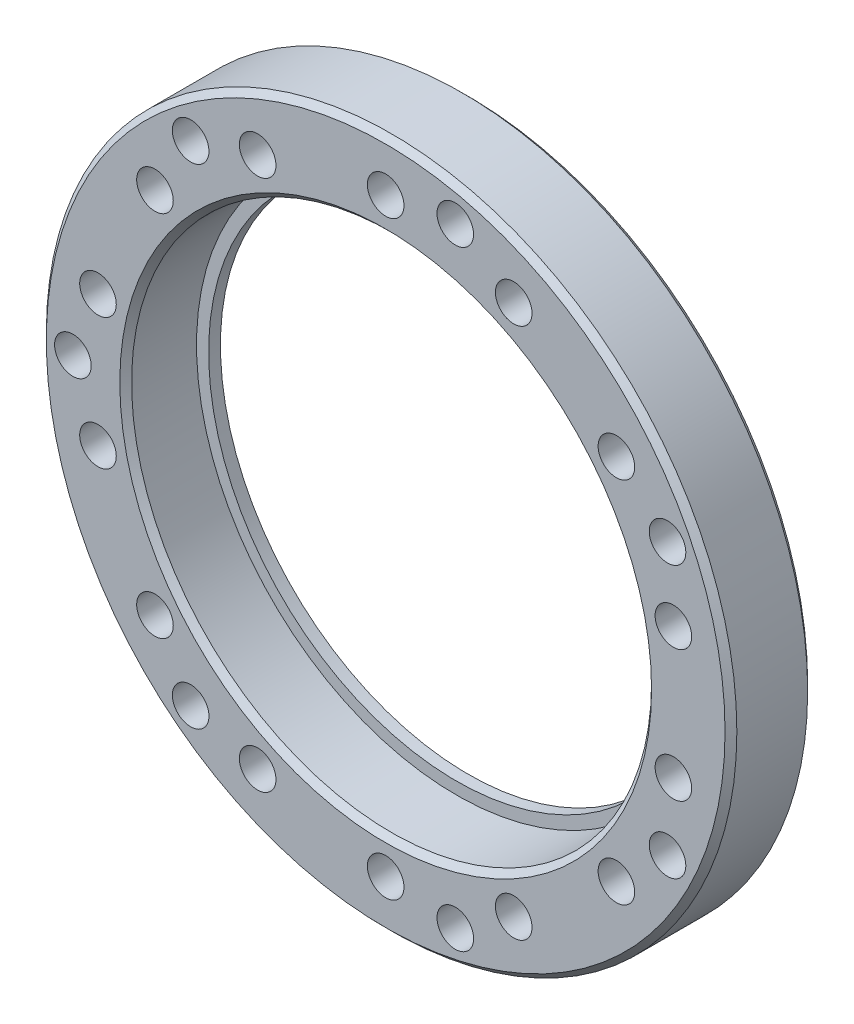
ISO-10303-21;
HEADER;
FILE_DESCRIPTION(('STEP AP214'),'2;1');
FILE_NAME('part.step','',(''),(''),'','','');
FILE_SCHEMA(('AUTOMOTIVE_DESIGN { 1 0 10303 214 1 1 1 1 }'));
ENDSEC;
DATA;
#1=APPLICATION_CONTEXT('core data for automotive mechanical design processes');
#2=APPLICATION_PROTOCOL_DEFINITION('international standard','automotive_design',2000,#1);
#3=PRODUCT_CONTEXT('',#1,'mechanical');
#4=PRODUCT('Part','Part','',(#3));
#5=PRODUCT_RELATED_PRODUCT_CATEGORY('part','',(#4));
#6=PRODUCT_DEFINITION_FORMATION('','',#4);
#7=PRODUCT_DEFINITION_CONTEXT('part definition',#1,'design');
#8=PRODUCT_DEFINITION('design','',#6,#7);
#9=PRODUCT_DEFINITION_SHAPE('','',#8);
#10=(LENGTH_UNIT() NAMED_UNIT(*) SI_UNIT(.MILLI.,.METRE.));
#11=(NAMED_UNIT(*) PLANE_ANGLE_UNIT() SI_UNIT($,.RADIAN.));
#12=(NAMED_UNIT(*) SI_UNIT($,.STERADIAN.) SOLID_ANGLE_UNIT());
#13=UNCERTAINTY_MEASURE_WITH_UNIT(LENGTH_MEASURE(1.E-05),#10,'distance_accuracy_value','');
#14=(GEOMETRIC_REPRESENTATION_CONTEXT(3) GLOBAL_UNCERTAINTY_ASSIGNED_CONTEXT((#13)) GLOBAL_UNIT_ASSIGNED_CONTEXT((#10,
#11,#12)) REPRESENTATION_CONTEXT('',''));
#15=CARTESIAN_POINT('',(0.,0.,0.));
#16=DIRECTION('',(0.,0.,1.));
#17=DIRECTION('',(1.,0.,0.));
#18=AXIS2_PLACEMENT_3D('',#15,#16,#17);
#19=CARTESIAN_POINT('',(0.,0.,7.));
#20=DIRECTION('',(0.,0.,-1.));
#21=DIRECTION('',(-1.,0.,0.));
#22=AXIS2_PLACEMENT_3D('',#19,#20,#21);
#23=CYLINDRICAL_SURFACE('',#22,29.25);
#24=CARTESIAN_POINT('',(0.,0.,6.50000000000001));
#25=DIRECTION('',(0.,0.,1.));
#26=DIRECTION('',(1.,0.,0.));
#27=AXIS2_PLACEMENT_3D('',#24,#25,#26);
#28=CIRCLE('',#27,29.25);
#29=CARTESIAN_POINT('',(29.25,0.,6.50000000000001));
#30=VERTEX_POINT('',#29);
#31=EDGE_CURVE('E47',#30,#30,#28,.F.);
#32=ORIENTED_EDGE('',*,*,#31,.T.);
#33=EDGE_LOOP('',(#32));
#34=FACE_BOUND('',#33,.T.);
#35=CARTESIAN_POINT('',(0.,0.,0.499999999999994));
#36=DIRECTION('',(0.,0.,1.));
#37=DIRECTION('',(1.,0.,0.));
#38=AXIS2_PLACEMENT_3D('',#35,#36,#37);
#39=CIRCLE('',#38,29.25);
#40=CARTESIAN_POINT('',(29.25,0.,0.499999999999994));
#41=VERTEX_POINT('',#40);
#42=EDGE_CURVE('E51',#41,#41,#39,.T.);
#43=ORIENTED_EDGE('',*,*,#42,.T.);
#44=EDGE_LOOP('',(#43));
#45=FACE_BOUND('',#44,.T.);
#46=ADVANCED_FACE('F39',(#34,#45),#23,.T.);
#47=CARTESIAN_POINT('',(0.,0.,7.));
#48=DIRECTION('',(0.,0.,-1.));
#49=DIRECTION('',(-1.,0.,0.));
#50=AXIS2_PLACEMENT_3D('',#47,#48,#49);
#51=CYLINDRICAL_SURFACE('',#50,22.025);
#52=CARTESIAN_POINT('',(0.,0.,6.5));
#53=DIRECTION('',(0.,0.,1.));
#54=DIRECTION('',(1.,0.,0.));
#55=AXIS2_PLACEMENT_3D('',#52,#53,#54);
#56=CIRCLE('',#55,22.025);
#57=CARTESIAN_POINT('',(22.025,0.,6.5));
#58=VERTEX_POINT('',#57);
#59=EDGE_CURVE('E63',#58,#58,#56,.T.);
#60=ORIENTED_EDGE('',*,*,#59,.T.);
#61=EDGE_LOOP('',(#60));
#62=FACE_BOUND('',#61,.T.);
#63=CARTESIAN_POINT('',(0.,0.,1.));
#64=DIRECTION('',(0.,0.,1.));
#65=DIRECTION('',(1.,0.,0.));
#66=AXIS2_PLACEMENT_3D('',#63,#64,#65);
#67=CIRCLE('',#66,22.025);
#68=CARTESIAN_POINT('',(22.025,0.,1.));
#69=VERTEX_POINT('',#68);
#70=EDGE_CURVE('E66',#69,#69,#67,.T.);
#71=ORIENTED_EDGE('',*,*,#70,.F.);
#72=EDGE_LOOP('',(#71));
#73=FACE_BOUND('',#72,.T.);
#74=ADVANCED_FACE('F209',(#62,#73),#51,.F.);
#75=CARTESIAN_POINT('',(0.,0.,7.));
#76=DIRECTION('',(0.,0.,1.));
#77=DIRECTION('',(1.,0.,0.));
#78=AXIS2_PLACEMENT_3D('',#75,#76,#77);
#79=PLANE('',#78);
#80=CARTESIAN_POINT('',(0.,0.,7.));
#81=DIRECTION('',(0.,0.,1.));
#82=DIRECTION('',(1.,0.,0.));
#83=AXIS2_PLACEMENT_3D('',#80,#81,#82);
#84=CIRCLE('',#83,22.525);
#85=CARTESIAN_POINT('',(22.525,0.,7.));
#86=VERTEX_POINT('',#85);
#87=EDGE_CURVE('E55',#86,#86,#84,.F.);
#88=ORIENTED_EDGE('',*,*,#87,.T.);
#89=EDGE_LOOP('',(#88));
#90=FACE_BOUND('',#89,.T.);
#91=CARTESIAN_POINT('',(0.,0.,7.));
#92=DIRECTION('',(0.,0.,1.));
#93=DIRECTION('',(1.,0.,0.));
#94=AXIS2_PLACEMENT_3D('',#91,#92,#93);
#95=CIRCLE('',#94,28.75);
#96=CARTESIAN_POINT('',(28.75,0.,7.));
#97=VERTEX_POINT('',#96);
#98=EDGE_CURVE('E60',#97,#97,#95,.T.);
#99=ORIENTED_EDGE('',*,*,#98,.T.);
#100=EDGE_LOOP('',(#99));
#101=FACE_BOUND('',#100,.T.);
#102=CARTESIAN_POINT('',(5.89680474984235,25.8355896728183,7.));
#103=DIRECTION('',(0.,0.,1.));
#104=DIRECTION('',(1.,0.,0.));
#105=AXIS2_PLACEMENT_3D('',#102,#103,#104);
#106=CIRCLE('',#105,1.55);
#107=CARTESIAN_POINT('',(7.44680474984235,25.8355896728183,7.));
#108=VERTEX_POINT('',#107);
#109=EDGE_CURVE('E163',#108,#108,#106,.T.);
#110=ORIENTED_EDGE('',*,*,#109,.F.);
#111=EDGE_LOOP('',(#110));
#112=FACE_BOUND('',#111,.T.);
#113=CARTESIAN_POINT('',(-16.5224797492562,20.7185342854018,7.));
#114=DIRECTION('',(0.,0.,1.));
#115=DIRECTION('',(1.,0.,0.));
#116=AXIS2_PLACEMENT_3D('',#113,#114,#115);
#117=CIRCLE('',#116,1.55);
#118=CARTESIAN_POINT('',(-14.9724797492562,20.7185342854018,7.));
#119=VERTEX_POINT('',#118);
#120=EDGE_CURVE('E182',#119,#119,#117,.T.);
#121=ORIENTED_EDGE('',*,*,#120,.F.);
#122=EDGE_LOOP('',(#121));
#123=FACE_BOUND('',#122,.T.);
#124=CARTESIAN_POINT('',(-26.4999999999989,-1.34180860866806E-12,7.));
#125=DIRECTION('',(0.,0.,1.));
#126=DIRECTION('',(1.,0.,0.));
#127=AXIS2_PLACEMENT_3D('',#124,#125,#126);
#128=CIRCLE('',#127,1.55);
#129=CARTESIAN_POINT('',(-24.9499999999989,-1.34180860866806E-12,7.));
#130=VERTEX_POINT('',#129);
#131=EDGE_CURVE('E176',#130,#130,#128,.T.);
#132=ORIENTED_EDGE('',*,*,#131,.F.);
#133=EDGE_LOOP('',(#132));
#134=FACE_BOUND('',#133,.T.);
#135=CARTESIAN_POINT('',(-16.5224797492544,-20.7185342854037,7.));
#136=DIRECTION('',(0.,0.,1.));
#137=DIRECTION('',(1.,0.,0.));
#138=AXIS2_PLACEMENT_3D('',#135,#136,#137);
#139=CIRCLE('',#138,1.55);
#140=CARTESIAN_POINT('',(-14.9724797492544,-20.7185342854037,7.));
#141=VERTEX_POINT('',#140);
#142=EDGE_CURVE('E169',#141,#141,#139,.T.);
#143=ORIENTED_EDGE('',*,*,#142,.F.);
#144=EDGE_LOOP('',(#143));
#145=FACE_BOUND('',#144,.T.);
#146=CARTESIAN_POINT('',(5.89680474984452,-25.8355896728183,7.));
#147=DIRECTION('',(0.,0.,1.));
#148=DIRECTION('',(1.,0.,0.));
#149=AXIS2_PLACEMENT_3D('',#146,#147,#148);
#150=CIRCLE('',#149,1.55);
#151=CARTESIAN_POINT('',(7.44680474984452,-25.8355896728183,7.));
#152=VERTEX_POINT('',#151);
#153=EDGE_CURVE('E170',#152,#152,#150,.T.);
#154=ORIENTED_EDGE('',*,*,#153,.F.);
#155=EDGE_LOOP('',(#154));
#156=FACE_BOUND('',#155,.T.);
#157=CARTESIAN_POINT('',(23.8756749994157,-11.4979190866145,7.));
#158=DIRECTION('',(0.,0.,1.));
#159=DIRECTION('',(1.,0.,0.));
#160=AXIS2_PLACEMENT_3D('',#157,#158,#159);
#161=CIRCLE('',#160,1.55);
#162=CARTESIAN_POINT('',(25.4256749994157,-11.4979190866145,7.));
#163=VERTEX_POINT('',#162);
#164=EDGE_CURVE('E193',#163,#163,#161,.T.);
#165=ORIENTED_EDGE('',*,*,#164,.F.);
#166=EDGE_LOOP('',(#165));
#167=FACE_BOUND('',#166,.T.);
#168=CARTESIAN_POINT('',(23.8756749994147,11.4979190866161,7.));
#169=DIRECTION('',(0.,0.,1.));
#170=DIRECTION('',(1.,0.,0.));
#171=AXIS2_PLACEMENT_3D('',#168,#169,#170);
#172=CIRCLE('',#171,1.55);
#173=CARTESIAN_POINT('',(25.4256749994147,11.4979190866161,7.));
#174=VERTEX_POINT('',#173);
#175=EDGE_CURVE('E157',#174,#174,#172,.T.);
#176=ORIENTED_EDGE('',*,*,#175,.F.);
#177=EDGE_LOOP('',(#176));
#178=FACE_BOUND('',#177,.T.);
#179=CARTESIAN_POINT('',(10.8470934779392,22.5242216975604,7.));
#180=DIRECTION('',(0.,0.,1.));
#181=DIRECTION('',(1.,0.,0.));
#182=AXIS2_PLACEMENT_3D('',#179,#180,#181);
#183=CIRCLE('',#182,1.55);
#184=CARTESIAN_POINT('',(12.3970934779392,22.5242216975604,7.));
#185=VERTEX_POINT('',#184);
#186=EDGE_CURVE('E119',#185,#185,#183,.T.);
#187=ORIENTED_EDGE('',*,*,#186,.F.);
#188=EDGE_LOOP('',(#187));
#189=FACE_BOUND('',#188,.T.);
#190=CARTESIAN_POINT('',(19.5457870617014,15.5872450464687,7.));
#191=DIRECTION('',(0.,0.,1.));
#192=DIRECTION('',(1.,0.,0.));
#193=AXIS2_PLACEMENT_3D('',#190,#191,#192);
#194=CIRCLE('',#193,1.55);
#195=CARTESIAN_POINT('',(21.0957870617014,15.5872450464687,7.));
#196=VERTEX_POINT('',#195);
#197=EDGE_CURVE('E113',#196,#196,#194,.T.);
#198=ORIENTED_EDGE('',*,*,#197,.F.);
#199=EDGE_LOOP('',(#198));
#200=FACE_BOUND('',#199,.T.);
#201=CARTESIAN_POINT('',(24.3731978045465,5.56302334890829,7.));
#202=DIRECTION('',(0.,0.,1.));
#203=DIRECTION('',(1.,0.,0.));
#204=AXIS2_PLACEMENT_3D('',#201,#202,#203);
#205=CIRCLE('',#204,1.55);
#206=CARTESIAN_POINT('',(25.9231978045465,5.56302334890829,7.));
#207=VERTEX_POINT('',#206);
#208=EDGE_CURVE('E107',#207,#207,#205,.T.);
#209=ORIENTED_EDGE('',*,*,#208,.F.);
#210=EDGE_LOOP('',(#209));
#211=FACE_BOUND('',#210,.T.);
#212=CARTESIAN_POINT('',(24.3731978045468,-5.5630233489075,7.));
#213=DIRECTION('',(0.,0.,1.));
#214=DIRECTION('',(1.,0.,0.));
#215=AXIS2_PLACEMENT_3D('',#212,#213,#214);
#216=CIRCLE('',#215,1.55);
#217=CARTESIAN_POINT('',(25.9231978045468,-5.5630233489075,7.));
#218=VERTEX_POINT('',#217);
#219=EDGE_CURVE('E101',#218,#218,#216,.T.);
#220=ORIENTED_EDGE('',*,*,#219,.F.);
#221=EDGE_LOOP('',(#220));
#222=FACE_BOUND('',#221,.T.);
#223=CARTESIAN_POINT('',(19.5457870617021,-15.5872450464682,7.));
#224=DIRECTION('',(0.,0.,1.));
#225=DIRECTION('',(1.,0.,0.));
#226=AXIS2_PLACEMENT_3D('',#223,#224,#225);
#227=CIRCLE('',#226,1.55);
#228=CARTESIAN_POINT('',(21.0957870617021,-15.5872450464682,7.));
#229=VERTEX_POINT('',#228);
#230=EDGE_CURVE('E95',#229,#229,#227,.T.);
#231=ORIENTED_EDGE('',*,*,#230,.F.);
#232=EDGE_LOOP('',(#231));
#233=FACE_BOUND('',#232,.T.);
#234=CARTESIAN_POINT('',(10.8470934779405,-22.5242216975606,7.));
#235=DIRECTION('',(0.,0.,1.));
#236=DIRECTION('',(1.,0.,0.));
#237=AXIS2_PLACEMENT_3D('',#234,#235,#236);
#238=CIRCLE('',#237,1.55);
#239=CARTESIAN_POINT('',(12.3970934779405,-22.5242216975606,7.));
#240=VERTEX_POINT('',#239);
#241=EDGE_CURVE('E89',#240,#240,#238,.T.);
#242=ORIENTED_EDGE('',*,*,#241,.F.);
#243=EDGE_LOOP('',(#242));
#244=FACE_BOUND('',#243,.T.);
#245=CARTESIAN_POINT('',(1.51614831800373E-12,-25.0000000000004,7.));
#246=DIRECTION('',(0.,0.,1.));
#247=DIRECTION('',(1.,0.,0.));
#248=AXIS2_PLACEMENT_3D('',#245,#246,#247);
#249=CIRCLE('',#248,1.55);
#250=CARTESIAN_POINT('',(1.55000000000152,-25.0000000000004,7.));
#251=VERTEX_POINT('',#250);
#252=EDGE_CURVE('E83',#251,#251,#249,.T.);
#253=ORIENTED_EDGE('',*,*,#252,.F.);
#254=EDGE_LOOP('',(#253));
#255=FACE_BOUND('',#254,.T.);
#256=CARTESIAN_POINT('',(-10.8470934779375,-22.5242216975612,7.));
#257=DIRECTION('',(0.,0.,1.));
#258=DIRECTION('',(1.,0.,0.));
#259=AXIS2_PLACEMENT_3D('',#256,#257,#258);
#260=CIRCLE('',#259,1.55);
#261=CARTESIAN_POINT('',(-9.29709347793754,-22.5242216975612,7.));
#262=VERTEX_POINT('',#261);
#263=EDGE_CURVE('E76',#262,#262,#260,.T.);
#264=ORIENTED_EDGE('',*,*,#263,.F.);
#265=EDGE_LOOP('',(#264));
#266=FACE_BOUND('',#265,.T.);
#267=CARTESIAN_POINT('',(-19.5457870616993,-15.5872450464695,7.));
#268=DIRECTION('',(0.,0.,1.));
#269=DIRECTION('',(1.,0.,0.));
#270=AXIS2_PLACEMENT_3D('',#267,#268,#269);
#271=CIRCLE('',#270,1.55);
#272=CARTESIAN_POINT('',(-17.9957870616993,-15.5872450464695,7.));
#273=VERTEX_POINT('',#272);
#274=EDGE_CURVE('E149',#273,#273,#271,.T.);
#275=ORIENTED_EDGE('',*,*,#274,.F.);
#276=EDGE_LOOP('',(#275));
#277=FACE_BOUND('',#276,.T.);
#278=CARTESIAN_POINT('',(-24.3731978045445,-5.56302334890922,7.));
#279=DIRECTION('',(0.,0.,1.));
#280=DIRECTION('',(1.,0.,0.));
#281=AXIS2_PLACEMENT_3D('',#278,#279,#280);
#282=CIRCLE('',#281,1.55);
#283=CARTESIAN_POINT('',(-22.8231978045445,-5.56302334890922,7.));
#284=VERTEX_POINT('',#283);
#285=EDGE_CURVE('E143',#284,#284,#282,.T.);
#286=ORIENTED_EDGE('',*,*,#285,.F.);
#287=EDGE_LOOP('',(#286));
#288=FACE_BOUND('',#287,.T.);
#289=CARTESIAN_POINT('',(-24.3731978045449,5.56302334890648,7.));
#290=DIRECTION('',(0.,0.,1.));
#291=DIRECTION('',(1.,0.,0.));
#292=AXIS2_PLACEMENT_3D('',#289,#290,#291);
#293=CIRCLE('',#292,1.55);
#294=CARTESIAN_POINT('',(-22.8231978045449,5.56302334890648,7.));
#295=VERTEX_POINT('',#294);
#296=EDGE_CURVE('E137',#295,#295,#293,.T.);
#297=ORIENTED_EDGE('',*,*,#296,.F.);
#298=EDGE_LOOP('',(#297));
#299=FACE_BOUND('',#298,.T.);
#300=CARTESIAN_POINT('',(-19.5457870617004,15.5872450464671,7.));
#301=DIRECTION('',(0.,0.,1.));
#302=DIRECTION('',(1.,0.,0.));
#303=AXIS2_PLACEMENT_3D('',#300,#301,#302);
#304=CIRCLE('',#303,1.55);
#305=CARTESIAN_POINT('',(-17.9957870617004,15.5872450464671,7.));
#306=VERTEX_POINT('',#305);
#307=EDGE_CURVE('E131',#306,#306,#304,.T.);
#308=ORIENTED_EDGE('',*,*,#307,.F.);
#309=EDGE_LOOP('',(#308));
#310=FACE_BOUND('',#309,.T.);
#311=CARTESIAN_POINT('',(-10.8470934779388,22.5242216975595,7.));
#312=DIRECTION('',(0.,0.,1.));
#313=DIRECTION('',(1.,0.,0.));
#314=AXIS2_PLACEMENT_3D('',#311,#312,#313);
#315=CIRCLE('',#314,1.55);
#316=CARTESIAN_POINT('',(-9.29709347793884,22.5242216975595,7.));
#317=VERTEX_POINT('',#316);
#318=EDGE_CURVE('E124',#317,#317,#315,.T.);
#319=ORIENTED_EDGE('',*,*,#318,.F.);
#320=EDGE_LOOP('',(#319));
#321=FACE_BOUND('',#320,.T.);
#322=CARTESIAN_POINT('',(0.,25.,7.));
#323=DIRECTION('',(0.,0.,1.));
#324=DIRECTION('',(1.,0.,0.));
#325=AXIS2_PLACEMENT_3D('',#322,#323,#324);
#326=CIRCLE('',#325,1.55);
#327=CARTESIAN_POINT('',(1.55,25.,7.));
#328=VERTEX_POINT('',#327);
#329=EDGE_CURVE('E70',#328,#328,#326,.T.);
#330=ORIENTED_EDGE('',*,*,#329,.F.);
#331=EDGE_LOOP('',(#330));
#332=FACE_BOUND('',#331,.T.);
#333=ADVANCED_FACE('F205',(#90,#101,#112,#123,#134,#145,#156,#167,#178,#189,#200,#211,#222,#233,
#244,#255,#266,#277,#288,#299,#310,#321,#332),#79,.T.);
#334=CARTESIAN_POINT('',(0.,0.,0.));
#335=DIRECTION('',(0.,0.,1.));
#336=DIRECTION('',(1.,0.,0.));
#337=AXIS2_PLACEMENT_3D('',#334,#335,#336);
#338=PLANE('',#337);
#339=CARTESIAN_POINT('',(0.,0.,0.));
#340=DIRECTION('',(0.,0.,1.));
#341=DIRECTION('',(1.,0.,0.));
#342=AXIS2_PLACEMENT_3D('',#339,#340,#341);
#343=CIRCLE('',#342,28.75);
#344=CARTESIAN_POINT('',(28.75,0.,0.));
#345=VERTEX_POINT('',#344);
#346=EDGE_CURVE('E10',#345,#345,#343,.F.);
#347=ORIENTED_EDGE('',*,*,#346,.T.);
#348=EDGE_LOOP('',(#347));
#349=FACE_BOUND('',#348,.T.);
#350=CARTESIAN_POINT('',(5.89680474984235,25.8355896728183,0.));
#351=DIRECTION('',(0.,0.,1.));
#352=DIRECTION('',(1.,0.,0.));
#353=AXIS2_PLACEMENT_3D('',#350,#351,#352);
#354=CIRCLE('',#353,1.55);
#355=CARTESIAN_POINT('',(7.44680474984235,25.8355896728183,0.));
#356=VERTEX_POINT('',#355);
#357=EDGE_CURVE('E185',#356,#356,#354,.T.);
#358=ORIENTED_EDGE('',*,*,#357,.T.);
#359=EDGE_LOOP('',(#358));
#360=FACE_BOUND('',#359,.T.);
#361=CARTESIAN_POINT('',(-16.5224797492562,20.7185342854018,0.));
#362=DIRECTION('',(0.,0.,1.));
#363=DIRECTION('',(1.,0.,0.));
#364=AXIS2_PLACEMENT_3D('',#361,#362,#363);
#365=CIRCLE('',#364,1.55);
#366=CARTESIAN_POINT('',(-14.9724797492562,20.7185342854018,0.));
#367=VERTEX_POINT('',#366);
#368=EDGE_CURVE('E179',#367,#367,#365,.T.);
#369=ORIENTED_EDGE('',*,*,#368,.T.);
#370=EDGE_LOOP('',(#369));
#371=FACE_BOUND('',#370,.T.);
#372=CARTESIAN_POINT('',(-26.4999999999989,-1.34180860866806E-12,0.));
#373=DIRECTION('',(0.,0.,1.));
#374=DIRECTION('',(1.,0.,0.));
#375=AXIS2_PLACEMENT_3D('',#372,#373,#374);
#376=CIRCLE('',#375,1.55);
#377=CARTESIAN_POINT('',(-24.9499999999989,-1.34180860866806E-12,0.));
#378=VERTEX_POINT('',#377);
#379=EDGE_CURVE('E173',#378,#378,#376,.T.);
#380=ORIENTED_EDGE('',*,*,#379,.T.);
#381=EDGE_LOOP('',(#380));
#382=FACE_BOUND('',#381,.T.);
#383=CARTESIAN_POINT('',(-16.5224797492544,-20.7185342854037,0.));
#384=DIRECTION('',(0.,0.,1.));
#385=DIRECTION('',(1.,0.,0.));
#386=AXIS2_PLACEMENT_3D('',#383,#384,#385);
#387=CIRCLE('',#386,1.55);
#388=CARTESIAN_POINT('',(-14.9724797492544,-20.7185342854037,0.));
#389=VERTEX_POINT('',#388);
#390=EDGE_CURVE('E166',#389,#389,#387,.T.);
#391=ORIENTED_EDGE('',*,*,#390,.T.);
#392=EDGE_LOOP('',(#391));
#393=FACE_BOUND('',#392,.T.);
#394=CARTESIAN_POINT('',(5.89680474984452,-25.8355896728183,0.));
#395=DIRECTION('',(0.,0.,1.));
#396=DIRECTION('',(1.,0.,0.));
#397=AXIS2_PLACEMENT_3D('',#394,#395,#396);
#398=CIRCLE('',#397,1.55);
#399=CARTESIAN_POINT('',(7.44680474984452,-25.8355896728183,0.));
#400=VERTEX_POINT('',#399);
#401=EDGE_CURVE('E196',#400,#400,#398,.T.);
#402=ORIENTED_EDGE('',*,*,#401,.T.);
#403=EDGE_LOOP('',(#402));
#404=FACE_BOUND('',#403,.T.);
#405=CARTESIAN_POINT('',(23.8756749994157,-11.4979190866145,0.));
#406=DIRECTION('',(0.,0.,1.));
#407=DIRECTION('',(1.,0.,0.));
#408=AXIS2_PLACEMENT_3D('',#405,#406,#407);
#409=CIRCLE('',#408,1.55);
#410=CARTESIAN_POINT('',(25.4256749994157,-11.4979190866145,0.));
#411=VERTEX_POINT('',#410);
#412=EDGE_CURVE('E190',#411,#411,#409,.T.);
#413=ORIENTED_EDGE('',*,*,#412,.T.);
#414=EDGE_LOOP('',(#413));
#415=FACE_BOUND('',#414,.T.);
#416=CARTESIAN_POINT('',(23.8756749994147,11.4979190866161,0.));
#417=DIRECTION('',(0.,0.,1.));
#418=DIRECTION('',(1.,0.,0.));
#419=AXIS2_PLACEMENT_3D('',#416,#417,#418);
#420=CIRCLE('',#419,1.55);
#421=CARTESIAN_POINT('',(25.4256749994147,11.4979190866161,0.));
#422=VERTEX_POINT('',#421);
#423=EDGE_CURVE('E160',#422,#422,#420,.T.);
#424=ORIENTED_EDGE('',*,*,#423,.T.);
#425=EDGE_LOOP('',(#424));
#426=FACE_BOUND('',#425,.T.);
#427=CARTESIAN_POINT('',(0.,0.,0.));
#428=DIRECTION('',(0.,0.,1.));
#429=DIRECTION('',(1.,0.,0.));
#430=AXIS2_PLACEMENT_3D('',#427,#428,#429);
#431=CIRCLE('',#430,21.);
#432=CARTESIAN_POINT('',(21.,0.,0.));
#433=VERTEX_POINT('',#432);
#434=EDGE_CURVE('E154',#433,#433,#431,.T.);
#435=ORIENTED_EDGE('',*,*,#434,.T.);
#436=EDGE_LOOP('',(#435));
#437=FACE_BOUND('',#436,.T.);
#438=ADVANCED_FACE('F208',(#349,#360,#371,#382,#393,#404,#415,#426,#437),#338,.F.);
#439=CARTESIAN_POINT('',(0.,25.,3.));
#440=DIRECTION('',(0.,0.,1.));
#441=DIRECTION('',(1.,0.,0.));
#442=AXIS2_PLACEMENT_3D('',#439,#440,#441);
#443=CYLINDRICAL_SURFACE('',#442,1.55);
#444=CARTESIAN_POINT('',(0.,25.,3.));
#445=DIRECTION('',(0.,0.,1.));
#446=DIRECTION('',(1.,0.,0.));
#447=AXIS2_PLACEMENT_3D('',#444,#445,#446);
#448=CIRCLE('',#447,1.55);
#449=CARTESIAN_POINT('',(1.55,25.,3.));
#450=VERTEX_POINT('',#449);
#451=EDGE_CURVE('E69',#450,#450,#448,.T.);
#452=ORIENTED_EDGE('',*,*,#451,.F.);
#453=EDGE_LOOP('',(#452));
#454=FACE_BOUND('',#453,.T.);
#455=ORIENTED_EDGE('',*,*,#329,.T.);
#456=EDGE_LOOP('',(#455));
#457=FACE_BOUND('',#456,.T.);
#458=ADVANCED_FACE('F244',(#454,#457),#443,.F.);
#459=CARTESIAN_POINT('',(0.,25.,3.));
#460=DIRECTION('',(0.,0.,1.));
#461=DIRECTION('',(1.,0.,0.));
#462=AXIS2_PLACEMENT_3D('',#459,#460,#461);
#463=PLANE('',#462);
#464=ORIENTED_EDGE('',*,*,#451,.T.);
#465=EDGE_LOOP('',(#464));
#466=FACE_BOUND('',#465,.T.);
#467=ADVANCED_FACE('F246',(#466),#463,.T.);
#468=CARTESIAN_POINT('',(-10.8470934779388,22.5242216975595,3.));
#469=DIRECTION('',(0.,0.,1.));
#470=DIRECTION('',(1.,0.,0.));
#471=AXIS2_PLACEMENT_3D('',#468,#469,#470);
#472=CYLINDRICAL_SURFACE('',#471,1.55);
#473=CARTESIAN_POINT('',(-10.8470934779388,22.5242216975595,3.));
#474=DIRECTION('',(0.,0.,1.));
#475=DIRECTION('',(1.,0.,0.));
#476=AXIS2_PLACEMENT_3D('',#473,#474,#475);
#477=CIRCLE('',#476,1.55);
#478=CARTESIAN_POINT('',(-9.29709347793884,22.5242216975595,3.));
#479=VERTEX_POINT('',#478);
#480=EDGE_CURVE('E127',#479,#479,#477,.T.);
#481=ORIENTED_EDGE('',*,*,#480,.F.);
#482=EDGE_LOOP('',(#481));
#483=FACE_BOUND('',#482,.T.);
#484=ORIENTED_EDGE('',*,*,#318,.T.);
#485=EDGE_LOOP('',(#484));
#486=FACE_BOUND('',#485,.T.);
#487=ADVANCED_FACE('F253',(#483,#486),#472,.F.);
#488=CARTESIAN_POINT('',(-10.8470934779388,22.5242216975595,3.));
#489=DIRECTION('',(0.,0.,1.));
#490=DIRECTION('',(1.,0.,0.));
#491=AXIS2_PLACEMENT_3D('',#488,#489,#490);
#492=PLANE('',#491);
#493=ORIENTED_EDGE('',*,*,#480,.T.);
#494=EDGE_LOOP('',(#493));
#495=FACE_BOUND('',#494,.T.);
#496=ADVANCED_FACE('F361',(#495),#492,.T.);
#497=CARTESIAN_POINT('',(-19.5457870617004,15.5872450464671,3.));
#498=DIRECTION('',(0.,0.,1.));
#499=DIRECTION('',(1.,0.,0.));
#500=AXIS2_PLACEMENT_3D('',#497,#498,#499);
#501=CYLINDRICAL_SURFACE('',#500,1.55);
#502=CARTESIAN_POINT('',(-19.5457870617004,15.5872450464671,3.));
#503=DIRECTION('',(0.,0.,1.));
#504=DIRECTION('',(1.,0.,0.));
#505=AXIS2_PLACEMENT_3D('',#502,#503,#504);
#506=CIRCLE('',#505,1.55);
#507=CARTESIAN_POINT('',(-17.9957870617004,15.5872450464671,3.));
#508=VERTEX_POINT('',#507);
#509=EDGE_CURVE('E134',#508,#508,#506,.T.);
#510=ORIENTED_EDGE('',*,*,#509,.F.);
#511=EDGE_LOOP('',(#510));
#512=FACE_BOUND('',#511,.T.);
#513=ORIENTED_EDGE('',*,*,#307,.T.);
#514=EDGE_LOOP('',(#513));
#515=FACE_BOUND('',#514,.T.);
#516=ADVANCED_FACE('F357',(#512,#515),#501,.F.);
#517=CARTESIAN_POINT('',(-19.5457870617004,15.5872450464671,3.));
#518=DIRECTION('',(0.,0.,1.));
#519=DIRECTION('',(1.,0.,0.));
#520=AXIS2_PLACEMENT_3D('',#517,#518,#519);
#521=PLANE('',#520);
#522=ORIENTED_EDGE('',*,*,#509,.T.);
#523=EDGE_LOOP('',(#522));
#524=FACE_BOUND('',#523,.T.);
#525=ADVANCED_FACE('F353',(#524),#521,.T.);
#526=CARTESIAN_POINT('',(-24.3731978045449,5.56302334890648,3.));
#527=DIRECTION('',(0.,0.,1.));
#528=DIRECTION('',(1.,0.,0.));
#529=AXIS2_PLACEMENT_3D('',#526,#527,#528);
#530=CYLINDRICAL_SURFACE('',#529,1.55);
#531=CARTESIAN_POINT('',(-24.3731978045449,5.56302334890648,3.));
#532=DIRECTION('',(0.,0.,1.));
#533=DIRECTION('',(1.,0.,0.));
#534=AXIS2_PLACEMENT_3D('',#531,#532,#533);
#535=CIRCLE('',#534,1.55);
#536=CARTESIAN_POINT('',(-22.8231978045449,5.56302334890648,3.));
#537=VERTEX_POINT('',#536);
#538=EDGE_CURVE('E140',#537,#537,#535,.T.);
#539=ORIENTED_EDGE('',*,*,#538,.F.);
#540=EDGE_LOOP('',(#539));
#541=FACE_BOUND('',#540,.T.);
#542=ORIENTED_EDGE('',*,*,#296,.T.);
#543=EDGE_LOOP('',(#542));
#544=FACE_BOUND('',#543,.T.);
#545=ADVANCED_FACE('F349',(#541,#544),#530,.F.);
#546=CARTESIAN_POINT('',(-24.3731978045449,5.56302334890648,3.));
#547=DIRECTION('',(0.,0.,1.));
#548=DIRECTION('',(1.,0.,0.));
#549=AXIS2_PLACEMENT_3D('',#546,#547,#548);
#550=PLANE('',#549);
#551=ORIENTED_EDGE('',*,*,#538,.T.);
#552=EDGE_LOOP('',(#551));
#553=FACE_BOUND('',#552,.T.);
#554=ADVANCED_FACE('F345',(#553),#550,.T.);
#555=CARTESIAN_POINT('',(-24.3731978045445,-5.56302334890922,3.));
#556=DIRECTION('',(0.,0.,1.));
#557=DIRECTION('',(1.,0.,0.));
#558=AXIS2_PLACEMENT_3D('',#555,#556,#557);
#559=CYLINDRICAL_SURFACE('',#558,1.55);
#560=CARTESIAN_POINT('',(-24.3731978045445,-5.56302334890922,3.));
#561=DIRECTION('',(0.,0.,1.));
#562=DIRECTION('',(1.,0.,0.));
#563=AXIS2_PLACEMENT_3D('',#560,#561,#562);
#564=CIRCLE('',#563,1.55);
#565=CARTESIAN_POINT('',(-22.8231978045445,-5.56302334890922,3.));
#566=VERTEX_POINT('',#565);
#567=EDGE_CURVE('E146',#566,#566,#564,.T.);
#568=ORIENTED_EDGE('',*,*,#567,.F.);
#569=EDGE_LOOP('',(#568));
#570=FACE_BOUND('',#569,.T.);
#571=ORIENTED_EDGE('',*,*,#285,.T.);
#572=EDGE_LOOP('',(#571));
#573=FACE_BOUND('',#572,.T.);
#574=ADVANCED_FACE('F341',(#570,#573),#559,.F.);
#575=CARTESIAN_POINT('',(-24.3731978045445,-5.56302334890922,3.));
#576=DIRECTION('',(0.,0.,1.));
#577=DIRECTION('',(1.,0.,0.));
#578=AXIS2_PLACEMENT_3D('',#575,#576,#577);
#579=PLANE('',#578);
#580=ORIENTED_EDGE('',*,*,#567,.T.);
#581=EDGE_LOOP('',(#580));
#582=FACE_BOUND('',#581,.T.);
#583=ADVANCED_FACE('F337',(#582),#579,.T.);
#584=CARTESIAN_POINT('',(-19.5457870616993,-15.5872450464695,3.));
#585=DIRECTION('',(0.,0.,1.));
#586=DIRECTION('',(1.,0.,0.));
#587=AXIS2_PLACEMENT_3D('',#584,#585,#586);
#588=CYLINDRICAL_SURFACE('',#587,1.55);
#589=CARTESIAN_POINT('',(-19.5457870616993,-15.5872450464695,3.));
#590=DIRECTION('',(0.,0.,1.));
#591=DIRECTION('',(1.,0.,0.));
#592=AXIS2_PLACEMENT_3D('',#589,#590,#591);
#593=CIRCLE('',#592,1.55);
#594=CARTESIAN_POINT('',(-17.9957870616993,-15.5872450464695,3.));
#595=VERTEX_POINT('',#594);
#596=EDGE_CURVE('E80',#595,#595,#593,.T.);
#597=ORIENTED_EDGE('',*,*,#596,.F.);
#598=EDGE_LOOP('',(#597));
#599=FACE_BOUND('',#598,.T.);
#600=ORIENTED_EDGE('',*,*,#274,.T.);
#601=EDGE_LOOP('',(#600));
#602=FACE_BOUND('',#601,.T.);
#603=ADVANCED_FACE('F333',(#599,#602),#588,.F.);
#604=CARTESIAN_POINT('',(-19.5457870616993,-15.5872450464695,3.));
#605=DIRECTION('',(0.,0.,1.));
#606=DIRECTION('',(1.,0.,0.));
#607=AXIS2_PLACEMENT_3D('',#604,#605,#606);
#608=PLANE('',#607);
#609=ORIENTED_EDGE('',*,*,#596,.T.);
#610=EDGE_LOOP('',(#609));
#611=FACE_BOUND('',#610,.T.);
#612=ADVANCED_FACE('F329',(#611),#608,.T.);
#613=CARTESIAN_POINT('',(-10.8470934779375,-22.5242216975612,3.));
#614=DIRECTION('',(0.,0.,1.));
#615=DIRECTION('',(1.,0.,0.));
#616=AXIS2_PLACEMENT_3D('',#613,#614,#615);
#617=CYLINDRICAL_SURFACE('',#616,1.55);
#618=CARTESIAN_POINT('',(-10.8470934779375,-22.5242216975612,3.));
#619=DIRECTION('',(0.,0.,1.));
#620=DIRECTION('',(1.,0.,0.));
#621=AXIS2_PLACEMENT_3D('',#618,#619,#620);
#622=CIRCLE('',#621,1.55);
#623=CARTESIAN_POINT('',(-9.29709347793754,-22.5242216975612,3.));
#624=VERTEX_POINT('',#623);
#625=EDGE_CURVE('E79',#624,#624,#622,.T.);
#626=ORIENTED_EDGE('',*,*,#625,.F.);
#627=EDGE_LOOP('',(#626));
#628=FACE_BOUND('',#627,.T.);
#629=ORIENTED_EDGE('',*,*,#263,.T.);
#630=EDGE_LOOP('',(#629));
#631=FACE_BOUND('',#630,.T.);
#632=ADVANCED_FACE('F332',(#628,#631),#617,.F.);
#633=CARTESIAN_POINT('',(-10.8470934779375,-22.5242216975612,3.));
#634=DIRECTION('',(0.,0.,1.));
#635=DIRECTION('',(1.,0.,0.));
#636=AXIS2_PLACEMENT_3D('',#633,#634,#635);
#637=PLANE('',#636);
#638=ORIENTED_EDGE('',*,*,#625,.T.);
#639=EDGE_LOOP('',(#638));
#640=FACE_BOUND('',#639,.T.);
#641=ADVANCED_FACE('F423',(#640),#637,.T.);
#642=CARTESIAN_POINT('',(1.51614831800373E-12,-25.0000000000004,3.));
#643=DIRECTION('',(0.,0.,1.));
#644=DIRECTION('',(1.,0.,0.));
#645=AXIS2_PLACEMENT_3D('',#642,#643,#644);
#646=CYLINDRICAL_SURFACE('',#645,1.55);
#647=CARTESIAN_POINT('',(1.51614831800373E-12,-25.0000000000004,3.));
#648=DIRECTION('',(0.,0.,1.));
#649=DIRECTION('',(1.,0.,0.));
#650=AXIS2_PLACEMENT_3D('',#647,#648,#649);
#651=CIRCLE('',#650,1.55);
#652=CARTESIAN_POINT('',(1.55000000000152,-25.0000000000004,3.));
#653=VERTEX_POINT('',#652);
#654=EDGE_CURVE('E86',#653,#653,#651,.T.);
#655=ORIENTED_EDGE('',*,*,#654,.F.);
#656=EDGE_LOOP('',(#655));
#657=FACE_BOUND('',#656,.T.);
#658=ORIENTED_EDGE('',*,*,#252,.T.);
#659=EDGE_LOOP('',(#658));
#660=FACE_BOUND('',#659,.T.);
#661=ADVANCED_FACE('F419',(#657,#660),#646,.F.);
#662=CARTESIAN_POINT('',(1.51614831800373E-12,-25.0000000000004,3.));
#663=DIRECTION('',(0.,0.,1.));
#664=DIRECTION('',(1.,0.,0.));
#665=AXIS2_PLACEMENT_3D('',#662,#663,#664);
#666=PLANE('',#665);
#667=ORIENTED_EDGE('',*,*,#654,.T.);
#668=EDGE_LOOP('',(#667));
#669=FACE_BOUND('',#668,.T.);
#670=ADVANCED_FACE('F415',(#669),#666,.T.);
#671=CARTESIAN_POINT('',(10.8470934779405,-22.5242216975606,3.));
#672=DIRECTION('',(0.,0.,1.));
#673=DIRECTION('',(1.,0.,0.));
#674=AXIS2_PLACEMENT_3D('',#671,#672,#673);
#675=CYLINDRICAL_SURFACE('',#674,1.55);
#676=CARTESIAN_POINT('',(10.8470934779405,-22.5242216975606,3.));
#677=DIRECTION('',(0.,0.,1.));
#678=DIRECTION('',(1.,0.,0.));
#679=AXIS2_PLACEMENT_3D('',#676,#677,#678);
#680=CIRCLE('',#679,1.55);
#681=CARTESIAN_POINT('',(12.3970934779405,-22.5242216975606,3.));
#682=VERTEX_POINT('',#681);
#683=EDGE_CURVE('E92',#682,#682,#680,.T.);
#684=ORIENTED_EDGE('',*,*,#683,.F.);
#685=EDGE_LOOP('',(#684));
#686=FACE_BOUND('',#685,.T.);
#687=ORIENTED_EDGE('',*,*,#241,.T.);
#688=EDGE_LOOP('',(#687));
#689=FACE_BOUND('',#688,.T.);
#690=ADVANCED_FACE('F411',(#686,#689),#675,.F.);
#691=CARTESIAN_POINT('',(10.8470934779405,-22.5242216975606,3.));
#692=DIRECTION('',(0.,0.,1.));
#693=DIRECTION('',(1.,0.,0.));
#694=AXIS2_PLACEMENT_3D('',#691,#692,#693);
#695=PLANE('',#694);
#696=ORIENTED_EDGE('',*,*,#683,.T.);
#697=EDGE_LOOP('',(#696));
#698=FACE_BOUND('',#697,.T.);
#699=ADVANCED_FACE('F407',(#698),#695,.T.);
#700=CARTESIAN_POINT('',(19.5457870617021,-15.5872450464682,3.));
#701=DIRECTION('',(0.,0.,1.));
#702=DIRECTION('',(1.,0.,0.));
#703=AXIS2_PLACEMENT_3D('',#700,#701,#702);
#704=CYLINDRICAL_SURFACE('',#703,1.55);
#705=CARTESIAN_POINT('',(19.5457870617021,-15.5872450464682,3.));
#706=DIRECTION('',(0.,0.,1.));
#707=DIRECTION('',(1.,0.,0.));
#708=AXIS2_PLACEMENT_3D('',#705,#706,#707);
#709=CIRCLE('',#708,1.55);
#710=CARTESIAN_POINT('',(21.0957870617021,-15.5872450464682,3.));
#711=VERTEX_POINT('',#710);
#712=EDGE_CURVE('E98',#711,#711,#709,.T.);
#713=ORIENTED_EDGE('',*,*,#712,.F.);
#714=EDGE_LOOP('',(#713));
#715=FACE_BOUND('',#714,.T.);
#716=ORIENTED_EDGE('',*,*,#230,.T.);
#717=EDGE_LOOP('',(#716));
#718=FACE_BOUND('',#717,.T.);
#719=ADVANCED_FACE('F403',(#715,#718),#704,.F.);
#720=CARTESIAN_POINT('',(19.5457870617021,-15.5872450464682,3.));
#721=DIRECTION('',(0.,0.,1.));
#722=DIRECTION('',(1.,0.,0.));
#723=AXIS2_PLACEMENT_3D('',#720,#721,#722);
#724=PLANE('',#723);
#725=ORIENTED_EDGE('',*,*,#712,.T.);
#726=EDGE_LOOP('',(#725));
#727=FACE_BOUND('',#726,.T.);
#728=ADVANCED_FACE('F399',(#727),#724,.T.);
#729=CARTESIAN_POINT('',(24.3731978045468,-5.5630233489075,3.));
#730=DIRECTION('',(0.,0.,1.));
#731=DIRECTION('',(1.,0.,0.));
#732=AXIS2_PLACEMENT_3D('',#729,#730,#731);
#733=CYLINDRICAL_SURFACE('',#732,1.55);
#734=CARTESIAN_POINT('',(24.3731978045468,-5.5630233489075,3.));
#735=DIRECTION('',(0.,0.,1.));
#736=DIRECTION('',(1.,0.,0.));
#737=AXIS2_PLACEMENT_3D('',#734,#735,#736);
#738=CIRCLE('',#737,1.55);
#739=CARTESIAN_POINT('',(25.9231978045468,-5.5630233489075,3.));
#740=VERTEX_POINT('',#739);
#741=EDGE_CURVE('E104',#740,#740,#738,.T.);
#742=ORIENTED_EDGE('',*,*,#741,.F.);
#743=EDGE_LOOP('',(#742));
#744=FACE_BOUND('',#743,.T.);
#745=ORIENTED_EDGE('',*,*,#219,.T.);
#746=EDGE_LOOP('',(#745));
#747=FACE_BOUND('',#746,.T.);
#748=ADVANCED_FACE('F395',(#744,#747),#733,.F.);
#749=CARTESIAN_POINT('',(24.3731978045468,-5.5630233489075,3.));
#750=DIRECTION('',(0.,0.,1.));
#751=DIRECTION('',(1.,0.,0.));
#752=AXIS2_PLACEMENT_3D('',#749,#750,#751);
#753=PLANE('',#752);
#754=ORIENTED_EDGE('',*,*,#741,.T.);
#755=EDGE_LOOP('',(#754));
#756=FACE_BOUND('',#755,.T.);
#757=ADVANCED_FACE('F391',(#756),#753,.T.);
#758=CARTESIAN_POINT('',(24.3731978045465,5.56302334890829,3.));
#759=DIRECTION('',(0.,0.,1.));
#760=DIRECTION('',(1.,0.,0.));
#761=AXIS2_PLACEMENT_3D('',#758,#759,#760);
#762=CYLINDRICAL_SURFACE('',#761,1.55);
#763=CARTESIAN_POINT('',(24.3731978045465,5.56302334890829,3.));
#764=DIRECTION('',(0.,0.,1.));
#765=DIRECTION('',(1.,0.,0.));
#766=AXIS2_PLACEMENT_3D('',#763,#764,#765);
#767=CIRCLE('',#766,1.55);
#768=CARTESIAN_POINT('',(25.9231978045465,5.56302334890829,3.));
#769=VERTEX_POINT('',#768);
#770=EDGE_CURVE('E110',#769,#769,#767,.T.);
#771=ORIENTED_EDGE('',*,*,#770,.F.);
#772=EDGE_LOOP('',(#771));
#773=FACE_BOUND('',#772,.T.);
#774=ORIENTED_EDGE('',*,*,#208,.T.);
#775=EDGE_LOOP('',(#774));
#776=FACE_BOUND('',#775,.T.);
#777=ADVANCED_FACE('F387',(#773,#776),#762,.F.);
#778=CARTESIAN_POINT('',(24.3731978045465,5.56302334890829,3.));
#779=DIRECTION('',(0.,0.,1.));
#780=DIRECTION('',(1.,0.,0.));
#781=AXIS2_PLACEMENT_3D('',#778,#779,#780);
#782=PLANE('',#781);
#783=ORIENTED_EDGE('',*,*,#770,.T.);
#784=EDGE_LOOP('',(#783));
#785=FACE_BOUND('',#784,.T.);
#786=ADVANCED_FACE('F383',(#785),#782,.T.);
#787=CARTESIAN_POINT('',(19.5457870617014,15.5872450464687,3.));
#788=DIRECTION('',(0.,0.,1.));
#789=DIRECTION('',(1.,0.,0.));
#790=AXIS2_PLACEMENT_3D('',#787,#788,#789);
#791=CYLINDRICAL_SURFACE('',#790,1.55);
#792=CARTESIAN_POINT('',(19.5457870617014,15.5872450464687,3.));
#793=DIRECTION('',(0.,0.,1.));
#794=DIRECTION('',(1.,0.,0.));
#795=AXIS2_PLACEMENT_3D('',#792,#793,#794);
#796=CIRCLE('',#795,1.55);
#797=CARTESIAN_POINT('',(21.0957870617014,15.5872450464687,3.));
#798=VERTEX_POINT('',#797);
#799=EDGE_CURVE('E116',#798,#798,#796,.T.);
#800=ORIENTED_EDGE('',*,*,#799,.F.);
#801=EDGE_LOOP('',(#800));
#802=FACE_BOUND('',#801,.T.);
#803=ORIENTED_EDGE('',*,*,#197,.T.);
#804=EDGE_LOOP('',(#803));
#805=FACE_BOUND('',#804,.T.);
#806=ADVANCED_FACE('F379',(#802,#805),#791,.F.);
#807=CARTESIAN_POINT('',(19.5457870617014,15.5872450464687,3.));
#808=DIRECTION('',(0.,0.,1.));
#809=DIRECTION('',(1.,0.,0.));
#810=AXIS2_PLACEMENT_3D('',#807,#808,#809);
#811=PLANE('',#810);
#812=ORIENTED_EDGE('',*,*,#799,.T.);
#813=EDGE_LOOP('',(#812));
#814=FACE_BOUND('',#813,.T.);
#815=ADVANCED_FACE('F375',(#814),#811,.T.);
#816=CARTESIAN_POINT('',(10.8470934779392,22.5242216975604,3.));
#817=DIRECTION('',(0.,0.,1.));
#818=DIRECTION('',(1.,0.,0.));
#819=AXIS2_PLACEMENT_3D('',#816,#817,#818);
#820=CYLINDRICAL_SURFACE('',#819,1.55);
#821=CARTESIAN_POINT('',(10.8470934779392,22.5242216975604,3.));
#822=DIRECTION('',(0.,0.,1.));
#823=DIRECTION('',(1.,0.,0.));
#824=AXIS2_PLACEMENT_3D('',#821,#822,#823);
#825=CIRCLE('',#824,1.55);
#826=CARTESIAN_POINT('',(12.3970934779392,22.5242216975604,3.));
#827=VERTEX_POINT('',#826);
#828=EDGE_CURVE('E73',#827,#827,#825,.T.);
#829=ORIENTED_EDGE('',*,*,#828,.F.);
#830=EDGE_LOOP('',(#829));
#831=FACE_BOUND('',#830,.T.);
#832=ORIENTED_EDGE('',*,*,#186,.T.);
#833=EDGE_LOOP('',(#832));
#834=FACE_BOUND('',#833,.T.);
#835=ADVANCED_FACE('F371',(#831,#834),#820,.F.);
#836=CARTESIAN_POINT('',(10.8470934779392,22.5242216975604,3.));
#837=DIRECTION('',(0.,0.,1.));
#838=DIRECTION('',(1.,0.,0.));
#839=AXIS2_PLACEMENT_3D('',#836,#837,#838);
#840=PLANE('',#839);
#841=ORIENTED_EDGE('',*,*,#828,.T.);
#842=EDGE_LOOP('',(#841));
#843=FACE_BOUND('',#842,.T.);
#844=ADVANCED_FACE('F325',(#843),#840,.T.);
#845=CARTESIAN_POINT('',(0.,0.,1.));
#846=DIRECTION('',(0.,0.,1.));
#847=DIRECTION('',(1.,0.,0.));
#848=AXIS2_PLACEMENT_3D('',#845,#846,#847);
#849=PLANE('',#848);
#850=CARTESIAN_POINT('',(0.,0.,1.));
#851=DIRECTION('',(0.,0.,1.));
#852=DIRECTION('',(1.,0.,0.));
#853=AXIS2_PLACEMENT_3D('',#850,#851,#852);
#854=CIRCLE('',#853,21.);
#855=CARTESIAN_POINT('',(21.,0.,1.));
#856=VERTEX_POINT('',#855);
#857=EDGE_CURVE('E128',#856,#856,#854,.T.);
#858=ORIENTED_EDGE('',*,*,#857,.F.);
#859=EDGE_LOOP('',(#858));
#860=FACE_BOUND('',#859,.T.);
#861=ORIENTED_EDGE('',*,*,#70,.T.);
#862=EDGE_LOOP('',(#861));
#863=FACE_BOUND('',#862,.T.);
#864=ADVANCED_FACE('F315',(#860,#863),#849,.T.);
#865=CARTESIAN_POINT('',(0.,0.,1.));
#866=DIRECTION('',(0.,0.,-1.));
#867=DIRECTION('',(-1.,0.,0.));
#868=AXIS2_PLACEMENT_3D('',#865,#866,#867);
#869=CYLINDRICAL_SURFACE('',#868,21.);
#870=ORIENTED_EDGE('',*,*,#857,.T.);
#871=EDGE_LOOP('',(#870));
#872=FACE_BOUND('',#871,.T.);
#873=ORIENTED_EDGE('',*,*,#434,.F.);
#874=EDGE_LOOP('',(#873));
#875=FACE_BOUND('',#874,.T.);
#876=ADVANCED_FACE('F312',(#872,#875),#869,.F.);
#877=CARTESIAN_POINT('',(23.8756749994147,11.4979190866161,7.));
#878=DIRECTION('',(0.,0.,-1.));
#879=DIRECTION('',(-1.,0.,0.));
#880=AXIS2_PLACEMENT_3D('',#877,#878,#879);
#881=CYLINDRICAL_SURFACE('',#880,1.55);
#882=ORIENTED_EDGE('',*,*,#175,.T.);
#883=EDGE_LOOP('',(#882));
#884=FACE_BOUND('',#883,.T.);
#885=ORIENTED_EDGE('',*,*,#423,.F.);
#886=EDGE_LOOP('',(#885));
#887=FACE_BOUND('',#886,.T.);
#888=ADVANCED_FACE('F314',(#884,#887),#881,.F.);
#889=CARTESIAN_POINT('',(23.8756749994157,-11.4979190866145,7.));
#890=DIRECTION('',(0.,0.,-1.));
#891=DIRECTION('',(-1.,0.,0.));
#892=AXIS2_PLACEMENT_3D('',#889,#890,#891);
#893=CYLINDRICAL_SURFACE('',#892,1.55);
#894=ORIENTED_EDGE('',*,*,#164,.T.);
#895=EDGE_LOOP('',(#894));
#896=FACE_BOUND('',#895,.T.);
#897=ORIENTED_EDGE('',*,*,#412,.F.);
#898=EDGE_LOOP('',(#897));
#899=FACE_BOUND('',#898,.T.);
#900=ADVANCED_FACE('F322',(#896,#899),#893,.F.);
#901=CARTESIAN_POINT('',(5.89680474984452,-25.8355896728183,7.));
#902=DIRECTION('',(0.,0.,-1.));
#903=DIRECTION('',(-1.,0.,0.));
#904=AXIS2_PLACEMENT_3D('',#901,#902,#903);
#905=CYLINDRICAL_SURFACE('',#904,1.55);
#906=ORIENTED_EDGE('',*,*,#153,.T.);
#907=EDGE_LOOP('',(#906));
#908=FACE_BOUND('',#907,.T.);
#909=ORIENTED_EDGE('',*,*,#401,.F.);
#910=EDGE_LOOP('',(#909));
#911=FACE_BOUND('',#910,.T.);
#912=ADVANCED_FACE('F202',(#908,#911),#905,.F.);
#913=CARTESIAN_POINT('',(-16.5224797492544,-20.7185342854037,7.));
#914=DIRECTION('',(0.,0.,-1.));
#915=DIRECTION('',(-1.,0.,0.));
#916=AXIS2_PLACEMENT_3D('',#913,#914,#915);
#917=CYLINDRICAL_SURFACE('',#916,1.55);
#918=ORIENTED_EDGE('',*,*,#142,.T.);
#919=EDGE_LOOP('',(#918));
#920=FACE_BOUND('',#919,.T.);
#921=ORIENTED_EDGE('',*,*,#390,.F.);
#922=EDGE_LOOP('',(#921));
#923=FACE_BOUND('',#922,.T.);
#924=ADVANCED_FACE('F296',(#920,#923),#917,.F.);
#925=CARTESIAN_POINT('',(-26.4999999999989,-1.34180860866806E-12,7.));
#926=DIRECTION('',(0.,0.,-1.));
#927=DIRECTION('',(-1.,0.,0.));
#928=AXIS2_PLACEMENT_3D('',#925,#926,#927);
#929=CYLINDRICAL_SURFACE('',#928,1.55);
#930=ORIENTED_EDGE('',*,*,#131,.T.);
#931=EDGE_LOOP('',(#930));
#932=FACE_BOUND('',#931,.T.);
#933=ORIENTED_EDGE('',*,*,#379,.F.);
#934=EDGE_LOOP('',(#933));
#935=FACE_BOUND('',#934,.T.);
#936=ADVANCED_FACE('F299',(#932,#935),#929,.F.);
#937=CARTESIAN_POINT('',(-16.5224797492562,20.7185342854018,7.));
#938=DIRECTION('',(0.,0.,-1.));
#939=DIRECTION('',(-1.,0.,0.));
#940=AXIS2_PLACEMENT_3D('',#937,#938,#939);
#941=CYLINDRICAL_SURFACE('',#940,1.55);
#942=ORIENTED_EDGE('',*,*,#120,.T.);
#943=EDGE_LOOP('',(#942));
#944=FACE_BOUND('',#943,.T.);
#945=ORIENTED_EDGE('',*,*,#368,.F.);
#946=EDGE_LOOP('',(#945));
#947=FACE_BOUND('',#946,.T.);
#948=ADVANCED_FACE('F543',(#944,#947),#941,.F.);
#949=CARTESIAN_POINT('',(5.89680474984235,25.8355896728183,7.));
#950=DIRECTION('',(0.,0.,-1.));
#951=DIRECTION('',(-1.,0.,0.));
#952=AXIS2_PLACEMENT_3D('',#949,#950,#951);
#953=CYLINDRICAL_SURFACE('',#952,1.55);
#954=ORIENTED_EDGE('',*,*,#109,.T.);
#955=EDGE_LOOP('',(#954));
#956=FACE_BOUND('',#955,.T.);
#957=ORIENTED_EDGE('',*,*,#357,.F.);
#958=EDGE_LOOP('',(#957));
#959=FACE_BOUND('',#958,.T.);
#960=ADVANCED_FACE('F274',(#956,#959),#953,.F.);
#961=CARTESIAN_POINT('',(0.,0.,6.5));
#962=DIRECTION('',(0.,0.,1.));
#963=DIRECTION('',(1.,0.,0.));
#964=AXIS2_PLACEMENT_3D('',#961,#962,#963);
#965=CONICAL_SURFACE('',#964,22.025,0.785398163397448);
#966=ORIENTED_EDGE('',*,*,#87,.F.);
#967=EDGE_LOOP('',(#966));
#968=FACE_BOUND('',#967,.T.);
#969=ORIENTED_EDGE('',*,*,#59,.F.);
#970=EDGE_LOOP('',(#969));
#971=FACE_BOUND('',#970,.T.);
#972=ADVANCED_FACE('F268',(#968,#971),#965,.F.);
#973=CARTESIAN_POINT('',(0.,0.,7.));
#974=DIRECTION('',(0.,0.,-1.));
#975=DIRECTION('',(-1.,0.,0.));
#976=AXIS2_PLACEMENT_3D('',#973,#974,#975);
#977=CONICAL_SURFACE('',#976,28.75,0.785398163397445);
#978=ORIENTED_EDGE('',*,*,#31,.F.);
#979=EDGE_LOOP('',(#978));
#980=FACE_BOUND('',#979,.T.);
#981=ORIENTED_EDGE('',*,*,#98,.F.);
#982=EDGE_LOOP('',(#981));
#983=FACE_BOUND('',#982,.T.);
#984=ADVANCED_FACE('F273',(#980,#983),#977,.T.);
#985=CARTESIAN_POINT('',(0.,0.,0.499999999999994));
#986=DIRECTION('',(0.,0.,1.));
#987=DIRECTION('',(1.,0.,0.));
#988=AXIS2_PLACEMENT_3D('',#985,#986,#987);
#989=CONICAL_SURFACE('',#988,29.25,0.785398163397452);
#990=ORIENTED_EDGE('',*,*,#346,.F.);
#991=EDGE_LOOP('',(#990));
#992=FACE_BOUND('',#991,.T.);
#993=ORIENTED_EDGE('',*,*,#42,.F.);
#994=EDGE_LOOP('',(#993));
#995=FACE_BOUND('',#994,.T.);
#996=ADVANCED_FACE('F42',(#992,#995),#989,.T.);
#997=CLOSED_SHELL('',(#46,#74,#333,#438,#458,#467,#487,#496,#516,#525,#545,#554,#574,#583,#603,
#612,#632,#641,#661,#670,#690,#699,#719,#728,#748,#757,#777,#786,#806,#815,#835,#844,#864,#876,
#888,#900,#912,#924,#936,#948,#960,#972,#984,#996));
#998=MANIFOLD_SOLID_BREP('B2',#997);
#999=ADVANCED_BREP_SHAPE_REPRESENTATION('',(#18,#998),#14);
#1000=SHAPE_DEFINITION_REPRESENTATION(#9,#999);
ENDSEC;
END-ISO-10303-21;
